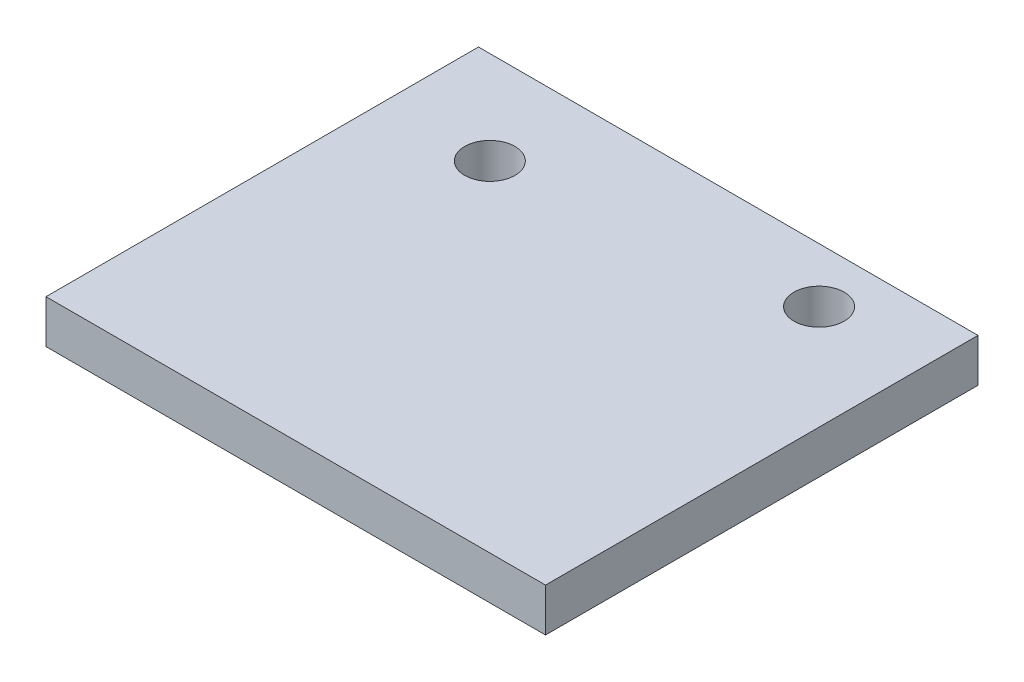
ISO-10303-21;
HEADER;
FILE_DESCRIPTION(('STEP AP214'),'2;1');
FILE_NAME('part.step','',(''),(''),'','','');
FILE_SCHEMA(('AUTOMOTIVE_DESIGN { 1 0 10303 214 1 1 1 1 }'));
ENDSEC;
DATA;
#1=APPLICATION_CONTEXT('core data for automotive mechanical design processes');
#2=APPLICATION_PROTOCOL_DEFINITION('international standard','automotive_design',2000,#1);
#3=PRODUCT_CONTEXT('',#1,'mechanical');
#4=PRODUCT('Part','Part','',(#3));
#5=PRODUCT_RELATED_PRODUCT_CATEGORY('part','',(#4));
#6=PRODUCT_DEFINITION_FORMATION('','',#4);
#7=PRODUCT_DEFINITION_CONTEXT('part definition',#1,'design');
#8=PRODUCT_DEFINITION('design','',#6,#7);
#9=PRODUCT_DEFINITION_SHAPE('','',#8);
#10=(LENGTH_UNIT() NAMED_UNIT(*) SI_UNIT(.MILLI.,.METRE.));
#11=(NAMED_UNIT(*) PLANE_ANGLE_UNIT() SI_UNIT($,.RADIAN.));
#12=(NAMED_UNIT(*) SI_UNIT($,.STERADIAN.) SOLID_ANGLE_UNIT());
#13=UNCERTAINTY_MEASURE_WITH_UNIT(LENGTH_MEASURE(1.E-05),#10,'distance_accuracy_value','');
#14=(GEOMETRIC_REPRESENTATION_CONTEXT(3) GLOBAL_UNCERTAINTY_ASSIGNED_CONTEXT((#13)) GLOBAL_UNIT_ASSIGNED_CONTEXT((#10,
#11,#12)) REPRESENTATION_CONTEXT('',''));
#15=CARTESIAN_POINT('',(0.,0.,0.));
#16=DIRECTION('',(0.,0.,1.));
#17=DIRECTION('',(1.,0.,0.));
#18=AXIS2_PLACEMENT_3D('',#15,#16,#17);
#19=CARTESIAN_POINT('',(0.,40.,0.));
#20=DIRECTION('',(0.,-1.,0.));
#21=DIRECTION('',(0.,0.,-1.));
#22=AXIS2_PLACEMENT_3D('',#19,#20,#21);
#23=PLANE('',#22);
#24=DIRECTION('',(0.,0.,1.));
#25=VECTOR('',#24,1.);
#26=CARTESIAN_POINT('',(0.,40.,0.));
#27=LINE('',#26,#25);
#28=CARTESIAN_POINT('',(0.,40.,-400.));
#29=VERTEX_POINT('',#28);
#30=CARTESIAN_POINT('',(0.,40.,0.));
#31=VERTEX_POINT('',#30);
#32=EDGE_CURVE('E103',#29,#31,#27,.T.);
#33=ORIENTED_EDGE('',*,*,#32,.T.);
#34=DIRECTION('',(1.,0.,0.));
#35=VECTOR('',#34,1.);
#36=CARTESIAN_POINT('',(0.,40.,0.));
#37=LINE('',#36,#35);
#38=CARTESIAN_POINT('',(462.,40.,0.));
#39=VERTEX_POINT('',#38);
#40=EDGE_CURVE('E98',#31,#39,#37,.T.);
#41=ORIENTED_EDGE('',*,*,#40,.T.);
#42=DIRECTION('',(0.,0.,-1.));
#43=VECTOR('',#42,1.);
#44=CARTESIAN_POINT('',(462.,40.,0.));
#45=LINE('',#44,#43);
#46=CARTESIAN_POINT('',(462.,40.,-400.));
#47=VERTEX_POINT('',#46);
#48=EDGE_CURVE('E101',#39,#47,#45,.T.);
#49=ORIENTED_EDGE('',*,*,#48,.T.);
#50=DIRECTION('',(-1.,0.,0.));
#51=VECTOR('',#50,1.);
#52=CARTESIAN_POINT('',(0.,40.,-400.));
#53=LINE('',#52,#51);
#54=EDGE_CURVE('E66',#47,#29,#53,.T.);
#55=ORIENTED_EDGE('',*,*,#54,.T.);
#56=EDGE_LOOP('',(#33,#41,#49,#55));
#57=FACE_BOUND('',#56,.T.);
#58=CARTESIAN_POINT('',(96.5,40.,-314.));
#59=DIRECTION('',(0.,1.,0.));
#60=DIRECTION('',(0.,0.,1.));
#61=AXIS2_PLACEMENT_3D('',#58,#59,#60);
#62=CIRCLE('',#61,23.25);
#63=CARTESIAN_POINT('',(96.5,40.,-290.75));
#64=VERTEX_POINT('',#63);
#65=EDGE_CURVE('E118',#64,#64,#62,.T.);
#66=ORIENTED_EDGE('',*,*,#65,.F.);
#67=EDGE_LOOP('',(#66));
#68=FACE_BOUND('',#67,.T.);
#69=CARTESIAN_POINT('',(365.5,40.,-349.5));
#70=DIRECTION('',(0.,1.,0.));
#71=DIRECTION('',(0.,0.,1.));
#72=AXIS2_PLACEMENT_3D('',#69,#70,#71);
#73=CIRCLE('',#72,23.25);
#74=CARTESIAN_POINT('',(365.5,40.,-326.25));
#75=VERTEX_POINT('',#74);
#76=EDGE_CURVE('E134',#75,#75,#73,.T.);
#77=ORIENTED_EDGE('',*,*,#76,.F.);
#78=EDGE_LOOP('',(#77));
#79=FACE_BOUND('',#78,.T.);
#80=ADVANCED_FACE('F49',(#57,#68,#79),#23,.F.);
#81=CARTESIAN_POINT('',(0.,0.,0.));
#82=DIRECTION('',(0.,-1.,0.));
#83=DIRECTION('',(0.,0.,-1.));
#84=AXIS2_PLACEMENT_3D('',#81,#82,#83);
#85=PLANE('',#84);
#86=CARTESIAN_POINT('',(96.5,0.,-314.));
#87=DIRECTION('',(0.,1.,0.));
#88=DIRECTION('',(0.,0.,1.));
#89=AXIS2_PLACEMENT_3D('',#86,#87,#88);
#90=CIRCLE('',#89,23.25);
#91=CARTESIAN_POINT('',(96.5,0.,-290.75));
#92=VERTEX_POINT('',#91);
#93=EDGE_CURVE('E131',#92,#92,#90,.T.);
#94=ORIENTED_EDGE('',*,*,#93,.T.);
#95=EDGE_LOOP('',(#94));
#96=FACE_BOUND('',#95,.T.);
#97=DIRECTION('',(0.,0.,1.));
#98=VECTOR('',#97,1.);
#99=CARTESIAN_POINT('',(0.,0.,0.));
#100=LINE('',#99,#98);
#101=CARTESIAN_POINT('',(0.,0.,-400.));
#102=VERTEX_POINT('',#101);
#103=CARTESIAN_POINT('',(0.,0.,0.));
#104=VERTEX_POINT('',#103);
#105=EDGE_CURVE('E115',#102,#104,#100,.T.);
#106=ORIENTED_EDGE('',*,*,#105,.F.);
#107=DIRECTION('',(-1.,0.,0.));
#108=VECTOR('',#107,1.);
#109=CARTESIAN_POINT('',(0.,0.,-400.));
#110=LINE('',#109,#108);
#111=CARTESIAN_POINT('',(462.,0.,-400.));
#112=VERTEX_POINT('',#111);
#113=EDGE_CURVE('E91',#112,#102,#110,.T.);
#114=ORIENTED_EDGE('',*,*,#113,.F.);
#115=DIRECTION('',(0.,0.,-1.));
#116=VECTOR('',#115,1.);
#117=CARTESIAN_POINT('',(462.,0.,0.));
#118=LINE('',#117,#116);
#119=CARTESIAN_POINT('',(462.,0.,0.));
#120=VERTEX_POINT('',#119);
#121=EDGE_CURVE('E85',#120,#112,#118,.T.);
#122=ORIENTED_EDGE('',*,*,#121,.F.);
#123=DIRECTION('',(1.,0.,0.));
#124=VECTOR('',#123,1.);
#125=CARTESIAN_POINT('',(0.,0.,0.));
#126=LINE('',#125,#124);
#127=EDGE_CURVE('E107',#104,#120,#126,.T.);
#128=ORIENTED_EDGE('',*,*,#127,.F.);
#129=EDGE_LOOP('',(#106,#114,#122,#128));
#130=FACE_BOUND('',#129,.T.);
#131=CARTESIAN_POINT('',(365.5,0.,-349.5));
#132=DIRECTION('',(0.,1.,0.));
#133=DIRECTION('',(0.,0.,1.));
#134=AXIS2_PLACEMENT_3D('',#131,#132,#133);
#135=CIRCLE('',#134,23.25);
#136=CARTESIAN_POINT('',(365.5,0.,-326.25));
#137=VERTEX_POINT('',#136);
#138=EDGE_CURVE('E137',#137,#137,#135,.T.);
#139=ORIENTED_EDGE('',*,*,#138,.T.);
#140=EDGE_LOOP('',(#139));
#141=FACE_BOUND('',#140,.T.);
#142=ADVANCED_FACE('F127',(#96,#130,#141),#85,.T.);
#143=CARTESIAN_POINT('',(0.,40.,0.));
#144=DIRECTION('',(1.,0.,0.));
#145=DIRECTION('',(0.,0.,-1.));
#146=AXIS2_PLACEMENT_3D('',#143,#144,#145);
#147=PLANE('',#146);
#148=ORIENTED_EDGE('',*,*,#105,.T.);
#149=DIRECTION('',(0.,-1.,0.));
#150=VECTOR('',#149,1.);
#151=CARTESIAN_POINT('',(0.,40.,0.));
#152=LINE('',#151,#150);
#153=EDGE_CURVE('E12',#31,#104,#152,.T.);
#154=ORIENTED_EDGE('',*,*,#153,.F.);
#155=ORIENTED_EDGE('',*,*,#32,.F.);
#156=DIRECTION('',(0.,-1.,0.));
#157=VECTOR('',#156,1.);
#158=CARTESIAN_POINT('',(0.,40.,-400.));
#159=LINE('',#158,#157);
#160=EDGE_CURVE('E111',#29,#102,#159,.T.);
#161=ORIENTED_EDGE('',*,*,#160,.T.);
#162=EDGE_LOOP('',(#148,#154,#155,#161));
#163=FACE_BOUND('',#162,.T.);
#164=ADVANCED_FACE('F51',(#163),#147,.F.);
#165=CARTESIAN_POINT('',(0.,40.,0.));
#166=DIRECTION('',(0.,0.,-1.));
#167=DIRECTION('',(-1.,0.,0.));
#168=AXIS2_PLACEMENT_3D('',#165,#166,#167);
#169=PLANE('',#168);
#170=ORIENTED_EDGE('',*,*,#127,.T.);
#171=DIRECTION('',(0.,-1.,0.));
#172=VECTOR('',#171,1.);
#173=CARTESIAN_POINT('',(462.,40.,0.));
#174=LINE('',#173,#172);
#175=EDGE_CURVE('E58',#39,#120,#174,.T.);
#176=ORIENTED_EDGE('',*,*,#175,.F.);
#177=ORIENTED_EDGE('',*,*,#40,.F.);
#178=ORIENTED_EDGE('',*,*,#153,.T.);
#179=EDGE_LOOP('',(#170,#176,#177,#178));
#180=FACE_BOUND('',#179,.T.);
#181=ADVANCED_FACE('F106',(#180),#169,.F.);
#182=CARTESIAN_POINT('',(462.,40.,0.));
#183=DIRECTION('',(-1.,0.,0.));
#184=DIRECTION('',(0.,0.,1.));
#185=AXIS2_PLACEMENT_3D('',#182,#183,#184);
#186=PLANE('',#185);
#187=ORIENTED_EDGE('',*,*,#121,.T.);
#188=DIRECTION('',(0.,-1.,0.));
#189=VECTOR('',#188,1.);
#190=CARTESIAN_POINT('',(462.,40.,-400.));
#191=LINE('',#190,#189);
#192=EDGE_CURVE('E108',#47,#112,#191,.T.);
#193=ORIENTED_EDGE('',*,*,#192,.F.);
#194=ORIENTED_EDGE('',*,*,#48,.F.);
#195=ORIENTED_EDGE('',*,*,#175,.T.);
#196=EDGE_LOOP('',(#187,#193,#194,#195));
#197=FACE_BOUND('',#196,.T.);
#198=ADVANCED_FACE('F109',(#197),#186,.F.);
#199=CARTESIAN_POINT('',(0.,40.,-400.));
#200=DIRECTION('',(0.,0.,1.));
#201=DIRECTION('',(1.,0.,0.));
#202=AXIS2_PLACEMENT_3D('',#199,#200,#201);
#203=PLANE('',#202);
#204=ORIENTED_EDGE('',*,*,#113,.T.);
#205=ORIENTED_EDGE('',*,*,#160,.F.);
#206=ORIENTED_EDGE('',*,*,#54,.F.);
#207=ORIENTED_EDGE('',*,*,#192,.T.);
#208=EDGE_LOOP('',(#204,#205,#206,#207));
#209=FACE_BOUND('',#208,.T.);
#210=ADVANCED_FACE('F124',(#209),#203,.F.);
#211=CARTESIAN_POINT('',(96.5,40.,-314.));
#212=DIRECTION('',(0.,-1.,0.));
#213=DIRECTION('',(0.,0.,-1.));
#214=AXIS2_PLACEMENT_3D('',#211,#212,#213);
#215=CYLINDRICAL_SURFACE('',#214,23.25);
#216=ORIENTED_EDGE('',*,*,#65,.T.);
#217=EDGE_LOOP('',(#216));
#218=FACE_BOUND('',#217,.T.);
#219=ORIENTED_EDGE('',*,*,#93,.F.);
#220=EDGE_LOOP('',(#219));
#221=FACE_BOUND('',#220,.T.);
#222=ADVANCED_FACE('F154',(#218,#221),#215,.F.);
#223=CARTESIAN_POINT('',(365.5,40.,-349.5));
#224=DIRECTION('',(0.,-1.,0.));
#225=DIRECTION('',(0.,0.,-1.));
#226=AXIS2_PLACEMENT_3D('',#223,#224,#225);
#227=CYLINDRICAL_SURFACE('',#226,23.25);
#228=ORIENTED_EDGE('',*,*,#76,.T.);
#229=EDGE_LOOP('',(#228));
#230=FACE_BOUND('',#229,.T.);
#231=ORIENTED_EDGE('',*,*,#138,.F.);
#232=EDGE_LOOP('',(#231));
#233=FACE_BOUND('',#232,.T.);
#234=ADVANCED_FACE('F143',(#230,#233),#227,.F.);
#235=CLOSED_SHELL('',(#80,#142,#164,#181,#198,#210,#222,#234));
#236=MANIFOLD_SOLID_BREP('B2',#235);
#237=ADVANCED_BREP_SHAPE_REPRESENTATION('',(#18,#236),#14);
#238=SHAPE_DEFINITION_REPRESENTATION(#9,#237);
ENDSEC;
END-ISO-10303-21;
